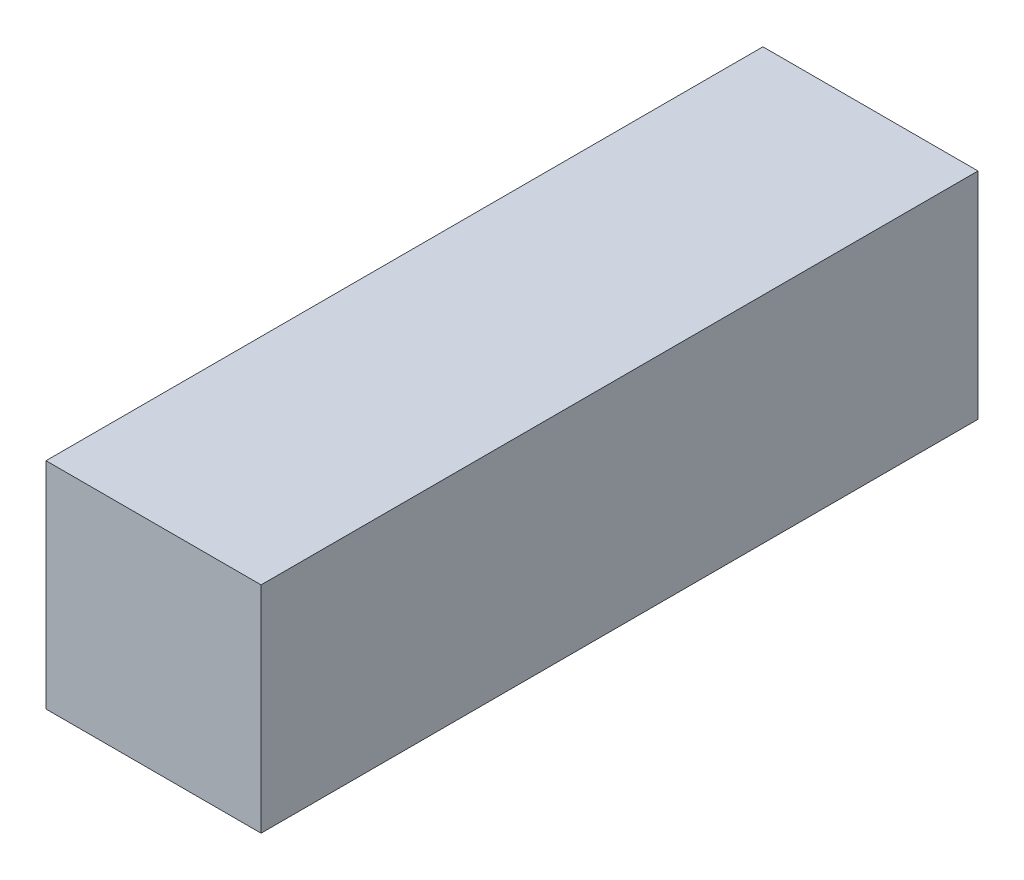
ISO-10303-21;
HEADER;
FILE_DESCRIPTION(('STEP AP214'),'2;1');
FILE_NAME('part.step','',(''),(''),'','','');
FILE_SCHEMA(('AUTOMOTIVE_DESIGN { 1 0 10303 214 1 1 1 1 }'));
ENDSEC;
DATA;
#1=APPLICATION_CONTEXT('core data for automotive mechanical design processes');
#2=APPLICATION_PROTOCOL_DEFINITION('international standard','automotive_design',2000,#1);
#3=PRODUCT_CONTEXT('',#1,'mechanical');
#4=PRODUCT('Part','Part','',(#3));
#5=PRODUCT_RELATED_PRODUCT_CATEGORY('part','',(#4));
#6=PRODUCT_DEFINITION_FORMATION('','',#4);
#7=PRODUCT_DEFINITION_CONTEXT('part definition',#1,'design');
#8=PRODUCT_DEFINITION('design','',#6,#7);
#9=PRODUCT_DEFINITION_SHAPE('','',#8);
#10=(LENGTH_UNIT() NAMED_UNIT(*) SI_UNIT(.MILLI.,.METRE.));
#11=(NAMED_UNIT(*) PLANE_ANGLE_UNIT() SI_UNIT($,.RADIAN.));
#12=(NAMED_UNIT(*) SI_UNIT($,.STERADIAN.) SOLID_ANGLE_UNIT());
#13=UNCERTAINTY_MEASURE_WITH_UNIT(LENGTH_MEASURE(1.E-05),#10,'distance_accuracy_value','');
#14=(GEOMETRIC_REPRESENTATION_CONTEXT(3) GLOBAL_UNCERTAINTY_ASSIGNED_CONTEXT((#13)) GLOBAL_UNIT_ASSIGNED_CONTEXT((#10,
#11,#12)) REPRESENTATION_CONTEXT('',''));
#15=CARTESIAN_POINT('',(0.,0.,0.));
#16=DIRECTION('',(0.,0.,1.));
#17=DIRECTION('',(1.,0.,0.));
#18=AXIS2_PLACEMENT_3D('',#15,#16,#17);
#19=CARTESIAN_POINT('',(-3.,-3.,20.));
#20=DIRECTION('',(0.,1.,0.));
#21=DIRECTION('',(-1.,0.,0.));
#22=AXIS2_PLACEMENT_3D('',#19,#20,#21);
#23=PLANE('',#22);
#24=DIRECTION('',(1.,0.,0.));
#25=VECTOR('',#24,1.);
#26=CARTESIAN_POINT('',(-3.,-3.,0.));
#27=LINE('',#26,#25);
#28=CARTESIAN_POINT('',(-3.,-3.,0.));
#29=VERTEX_POINT('',#28);
#30=CARTESIAN_POINT('',(3.,-3.,0.));
#31=VERTEX_POINT('',#30);
#32=EDGE_CURVE('E105',#29,#31,#27,.T.);
#33=ORIENTED_EDGE('',*,*,#32,.T.);
#34=DIRECTION('',(0.,0.,-1.));
#35=VECTOR('',#34,1.);
#36=CARTESIAN_POINT('',(3.,-3.,20.));
#37=LINE('',#36,#35);
#38=CARTESIAN_POINT('',(3.,-3.,20.));
#39=VERTEX_POINT('',#38);
#40=EDGE_CURVE('E11',#39,#31,#37,.T.);
#41=ORIENTED_EDGE('',*,*,#40,.F.);
#42=DIRECTION('',(1.,0.,0.));
#43=VECTOR('',#42,1.);
#44=CARTESIAN_POINT('',(-3.,-3.,20.));
#45=LINE('',#44,#43);
#46=CARTESIAN_POINT('',(-3.,-3.,20.));
#47=VERTEX_POINT('',#46);
#48=EDGE_CURVE('E89',#47,#39,#45,.T.);
#49=ORIENTED_EDGE('',*,*,#48,.F.);
#50=DIRECTION('',(0.,0.,-1.));
#51=VECTOR('',#50,1.);
#52=CARTESIAN_POINT('',(-3.,-3.,20.));
#53=LINE('',#52,#51);
#54=EDGE_CURVE('E97',#47,#29,#53,.T.);
#55=ORIENTED_EDGE('',*,*,#54,.T.);
#56=EDGE_LOOP('',(#33,#41,#49,#55));
#57=FACE_BOUND('',#56,.T.);
#58=ADVANCED_FACE('F39',(#57),#23,.F.);
#59=CARTESIAN_POINT('',(3.,3.,20.));
#60=DIRECTION('',(-1.,0.,0.));
#61=DIRECTION('',(0.,-1.,0.));
#62=AXIS2_PLACEMENT_3D('',#59,#60,#61);
#63=PLANE('',#62);
#64=DIRECTION('',(0.,1.,0.));
#65=VECTOR('',#64,1.);
#66=CARTESIAN_POINT('',(3.,3.,0.));
#67=LINE('',#66,#65);
#68=CARTESIAN_POINT('',(3.,3.,0.));
#69=VERTEX_POINT('',#68);
#70=EDGE_CURVE('E92',#31,#69,#67,.T.);
#71=ORIENTED_EDGE('',*,*,#70,.T.);
#72=DIRECTION('',(0.,0.,-1.));
#73=VECTOR('',#72,1.);
#74=CARTESIAN_POINT('',(3.,3.,20.));
#75=LINE('',#74,#73);
#76=CARTESIAN_POINT('',(3.,3.,20.));
#77=VERTEX_POINT('',#76);
#78=EDGE_CURVE('E50',#77,#69,#75,.T.);
#79=ORIENTED_EDGE('',*,*,#78,.F.);
#80=DIRECTION('',(0.,1.,0.));
#81=VECTOR('',#80,1.);
#82=CARTESIAN_POINT('',(3.,3.,20.));
#83=LINE('',#82,#81);
#84=EDGE_CURVE('E82',#39,#77,#83,.T.);
#85=ORIENTED_EDGE('',*,*,#84,.F.);
#86=ORIENTED_EDGE('',*,*,#40,.T.);
#87=EDGE_LOOP('',(#71,#79,#85,#86));
#88=FACE_BOUND('',#87,.T.);
#89=ADVANCED_FACE('F93',(#88),#63,.F.);
#90=CARTESIAN_POINT('',(-3.,3.,20.));
#91=DIRECTION('',(0.,-1.,0.));
#92=DIRECTION('',(1.,0.,0.));
#93=AXIS2_PLACEMENT_3D('',#90,#91,#92);
#94=PLANE('',#93);
#95=DIRECTION('',(-1.,0.,0.));
#96=VECTOR('',#95,1.);
#97=CARTESIAN_POINT('',(-3.,3.,0.));
#98=LINE('',#97,#96);
#99=CARTESIAN_POINT('',(-3.,3.,0.));
#100=VERTEX_POINT('',#99);
#101=EDGE_CURVE('E72',#69,#100,#98,.T.);
#102=ORIENTED_EDGE('',*,*,#101,.T.);
#103=DIRECTION('',(0.,0.,-1.));
#104=VECTOR('',#103,1.);
#105=CARTESIAN_POINT('',(-3.,3.,20.));
#106=LINE('',#105,#104);
#107=CARTESIAN_POINT('',(-3.,3.,20.));
#108=VERTEX_POINT('',#107);
#109=EDGE_CURVE('E94',#108,#100,#106,.T.);
#110=ORIENTED_EDGE('',*,*,#109,.F.);
#111=DIRECTION('',(-1.,0.,0.));
#112=VECTOR('',#111,1.);
#113=CARTESIAN_POINT('',(-3.,3.,20.));
#114=LINE('',#113,#112);
#115=EDGE_CURVE('E88',#77,#108,#114,.T.);
#116=ORIENTED_EDGE('',*,*,#115,.F.);
#117=ORIENTED_EDGE('',*,*,#78,.T.);
#118=EDGE_LOOP('',(#102,#110,#116,#117));
#119=FACE_BOUND('',#118,.T.);
#120=ADVANCED_FACE('F96',(#119),#94,.F.);
#121=CARTESIAN_POINT('',(-3.,3.,20.));
#122=DIRECTION('',(1.,0.,0.));
#123=DIRECTION('',(0.,1.,0.));
#124=AXIS2_PLACEMENT_3D('',#121,#122,#123);
#125=PLANE('',#124);
#126=DIRECTION('',(0.,-1.,0.));
#127=VECTOR('',#126,1.);
#128=CARTESIAN_POINT('',(-3.,3.,0.));
#129=LINE('',#128,#127);
#130=EDGE_CURVE('E76',#100,#29,#129,.T.);
#131=ORIENTED_EDGE('',*,*,#130,.T.);
#132=ORIENTED_EDGE('',*,*,#54,.F.);
#133=DIRECTION('',(0.,-1.,0.));
#134=VECTOR('',#133,1.);
#135=CARTESIAN_POINT('',(-3.,3.,20.));
#136=LINE('',#135,#134);
#137=EDGE_CURVE('E54',#108,#47,#136,.T.);
#138=ORIENTED_EDGE('',*,*,#137,.F.);
#139=ORIENTED_EDGE('',*,*,#109,.T.);
#140=EDGE_LOOP('',(#131,#132,#138,#139));
#141=FACE_BOUND('',#140,.T.);
#142=ADVANCED_FACE('F108',(#141),#125,.F.);
#143=CARTESIAN_POINT('',(0.,0.,20.));
#144=DIRECTION('',(0.,0.,-1.));
#145=DIRECTION('',(-1.,0.,0.));
#146=AXIS2_PLACEMENT_3D('',#143,#144,#145);
#147=PLANE('',#146);
#148=ORIENTED_EDGE('',*,*,#48,.T.);
#149=ORIENTED_EDGE('',*,*,#84,.T.);
#150=ORIENTED_EDGE('',*,*,#115,.T.);
#151=ORIENTED_EDGE('',*,*,#137,.T.);
#152=EDGE_LOOP('',(#148,#149,#150,#151));
#153=FACE_BOUND('',#152,.T.);
#154=ADVANCED_FACE('F86',(#153),#147,.F.);
#155=CARTESIAN_POINT('',(0.,0.,0.));
#156=DIRECTION('',(0.,0.,-1.));
#157=DIRECTION('',(-1.,0.,0.));
#158=AXIS2_PLACEMENT_3D('',#155,#156,#157);
#159=PLANE('',#158);
#160=ORIENTED_EDGE('',*,*,#32,.F.);
#161=ORIENTED_EDGE('',*,*,#130,.F.);
#162=ORIENTED_EDGE('',*,*,#101,.F.);
#163=ORIENTED_EDGE('',*,*,#70,.F.);
#164=EDGE_LOOP('',(#160,#161,#162,#163));
#165=FACE_BOUND('',#164,.T.);
#166=ADVANCED_FACE('F115',(#165),#159,.T.);
#167=CLOSED_SHELL('',(#58,#89,#120,#142,#154,#166));
#168=MANIFOLD_SOLID_BREP('B2',#167);
#169=ADVANCED_BREP_SHAPE_REPRESENTATION('',(#18,#168),#14);
#170=SHAPE_DEFINITION_REPRESENTATION(#9,#169);
ENDSEC;
END-ISO-10303-21;
